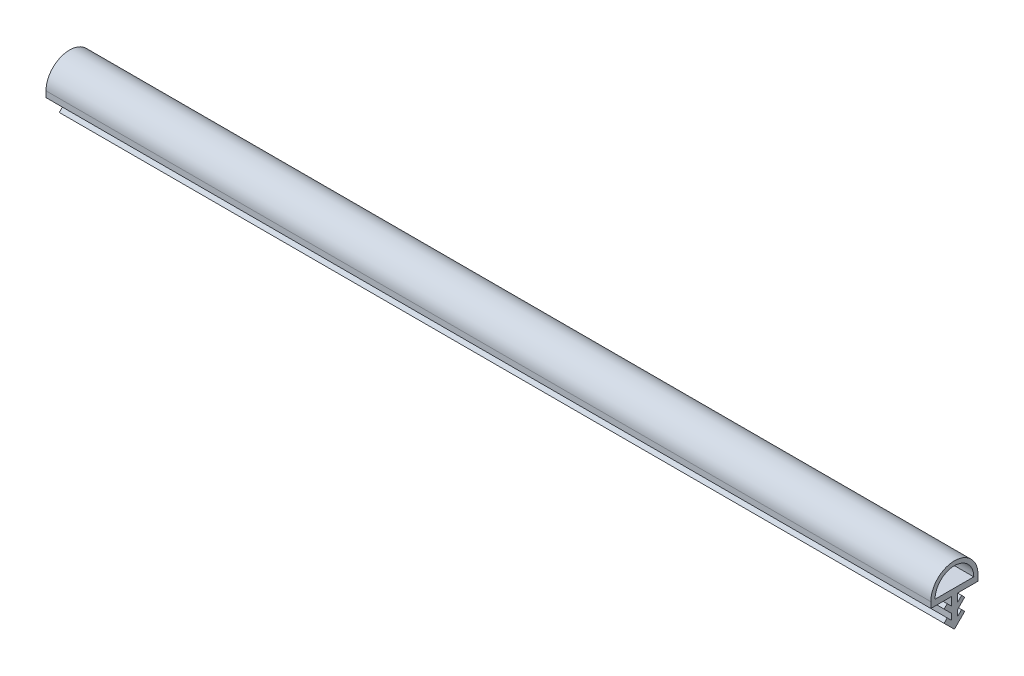
ISO-10303-21;
HEADER;
FILE_DESCRIPTION(('STEP AP214'),'2;1');
FILE_NAME('part.step','',(''),(''),'','','');
FILE_SCHEMA(('AUTOMOTIVE_DESIGN { 1 0 10303 214 1 1 1 1 }'));
ENDSEC;
DATA;
#1=APPLICATION_CONTEXT('core data for automotive mechanical design processes');
#2=APPLICATION_PROTOCOL_DEFINITION('international standard','automotive_design',2000,#1);
#3=PRODUCT_CONTEXT('',#1,'mechanical');
#4=PRODUCT('Part','Part','',(#3));
#5=PRODUCT_RELATED_PRODUCT_CATEGORY('part','',(#4));
#6=PRODUCT_DEFINITION_FORMATION('','',#4);
#7=PRODUCT_DEFINITION_CONTEXT('part definition',#1,'design');
#8=PRODUCT_DEFINITION('design','',#6,#7);
#9=PRODUCT_DEFINITION_SHAPE('','',#8);
#10=(LENGTH_UNIT() NAMED_UNIT(*) SI_UNIT(.MILLI.,.METRE.));
#11=(NAMED_UNIT(*) PLANE_ANGLE_UNIT() SI_UNIT($,.RADIAN.));
#12=(NAMED_UNIT(*) SI_UNIT($,.STERADIAN.) SOLID_ANGLE_UNIT());
#13=UNCERTAINTY_MEASURE_WITH_UNIT(LENGTH_MEASURE(1.E-05),#10,'distance_accuracy_value','');
#14=(GEOMETRIC_REPRESENTATION_CONTEXT(3) GLOBAL_UNCERTAINTY_ASSIGNED_CONTEXT((#13)) GLOBAL_UNIT_ASSIGNED_CONTEXT((#10,
#11,#12)) REPRESENTATION_CONTEXT('',''));
#15=CARTESIAN_POINT('',(0.,0.,0.));
#16=DIRECTION('',(0.,0.,1.));
#17=DIRECTION('',(1.,0.,0.));
#18=AXIS2_PLACEMENT_3D('',#15,#16,#17);
#19=CARTESIAN_POINT('',(-75.,0.999999999999999,0.));
#20=DIRECTION('',(1.,0.,0.));
#21=DIRECTION('',(0.,0.,-1.));
#22=AXIS2_PLACEMENT_3D('',#19,#20,#21);
#23=CYLINDRICAL_SURFACE('',#22,4.);
#24=DIRECTION('',(1.,0.,0.));
#25=VECTOR('',#24,1.);
#26=CARTESIAN_POINT('',(-75.,0.999999999999998,3.99999999999999));
#27=LINE('',#26,#25);
#28=CARTESIAN_POINT('',(-75.,0.999999999999998,3.99999999999999));
#29=VERTEX_POINT('',#28);
#30=CARTESIAN_POINT('',(75.,0.999999999999998,3.99999999999999));
#31=VERTEX_POINT('',#30);
#32=EDGE_CURVE('E40',#29,#31,#27,.T.);
#33=ORIENTED_EDGE('',*,*,#32,.T.);
#34=CARTESIAN_POINT('',(75.,0.999999999999999,0.));
#35=DIRECTION('',(1.,0.,0.));
#36=DIRECTION('',(0.,0.,-1.));
#37=AXIS2_PLACEMENT_3D('',#34,#35,#36);
#38=CIRCLE('',#37,4.);
#39=CARTESIAN_POINT('',(75.,1.,-4.00000000000001));
#40=VERTEX_POINT('',#39);
#41=EDGE_CURVE('E205',#40,#31,#38,.T.);
#42=ORIENTED_EDGE('',*,*,#41,.F.);
#43=DIRECTION('',(1.,0.,0.));
#44=VECTOR('',#43,1.);
#45=CARTESIAN_POINT('',(-75.,1.,-4.00000000000001));
#46=LINE('',#45,#44);
#47=CARTESIAN_POINT('',(-75.,1.,-4.00000000000001));
#48=VERTEX_POINT('',#47);
#49=EDGE_CURVE('E11',#48,#40,#46,.T.);
#50=ORIENTED_EDGE('',*,*,#49,.F.);
#51=CARTESIAN_POINT('',(-75.,0.999999999999999,0.));
#52=DIRECTION('',(1.,0.,0.));
#53=DIRECTION('',(0.,0.,-1.));
#54=AXIS2_PLACEMENT_3D('',#51,#52,#53);
#55=CIRCLE('',#54,4.);
#56=EDGE_CURVE('E199',#48,#29,#55,.T.);
#57=ORIENTED_EDGE('',*,*,#56,.T.);
#58=EDGE_LOOP('',(#33,#42,#50,#57));
#59=FACE_BOUND('',#58,.T.);
#60=ADVANCED_FACE('F37',(#59),#23,.T.);
#61=CARTESIAN_POINT('',(-75.,0.,-4.));
#62=DIRECTION('',(0.,0.,-1.));
#63=DIRECTION('',(0.,1.,0.));
#64=AXIS2_PLACEMENT_3D('',#61,#62,#63);
#65=PLANE('',#64);
#66=ORIENTED_EDGE('',*,*,#49,.T.);
#67=DIRECTION('',(0.,1.,0.));
#68=VECTOR('',#67,1.);
#69=CARTESIAN_POINT('',(75.,0.,-4.));
#70=LINE('',#69,#68);
#71=CARTESIAN_POINT('',(75.,0.,-4.));
#72=VERTEX_POINT('',#71);
#73=EDGE_CURVE('E269',#72,#40,#70,.T.);
#74=ORIENTED_EDGE('',*,*,#73,.F.);
#75=DIRECTION('',(1.,0.,0.));
#76=VECTOR('',#75,1.);
#77=CARTESIAN_POINT('',(-75.,0.,-4.));
#78=LINE('',#77,#76);
#79=CARTESIAN_POINT('',(-75.,0.,-4.));
#80=VERTEX_POINT('',#79);
#81=EDGE_CURVE('E45',#80,#72,#78,.T.);
#82=ORIENTED_EDGE('',*,*,#81,.F.);
#83=DIRECTION('',(0.,1.,0.));
#84=VECTOR('',#83,1.);
#85=CARTESIAN_POINT('',(-75.,0.,-4.));
#86=LINE('',#85,#84);
#87=EDGE_CURVE('E334',#80,#48,#86,.T.);
#88=ORIENTED_EDGE('',*,*,#87,.T.);
#89=EDGE_LOOP('',(#66,#74,#82,#88));
#90=FACE_BOUND('',#89,.T.);
#91=ADVANCED_FACE('F381',(#90),#65,.T.);
#92=CARTESIAN_POINT('',(-75.,0.,-4.));
#93=DIRECTION('',(0.,-1.,0.));
#94=DIRECTION('',(0.,0.,-1.));
#95=AXIS2_PLACEMENT_3D('',#92,#93,#94);
#96=PLANE('',#95);
#97=ORIENTED_EDGE('',*,*,#81,.T.);
#98=DIRECTION('',(0.,0.,-1.));
#99=VECTOR('',#98,1.);
#100=CARTESIAN_POINT('',(75.,0.,-4.));
#101=LINE('',#100,#99);
#102=CARTESIAN_POINT('',(75.,0.,-0.500000000000004));
#103=VERTEX_POINT('',#102);
#104=EDGE_CURVE('E266',#103,#72,#101,.T.);
#105=ORIENTED_EDGE('',*,*,#104,.F.);
#106=DIRECTION('',(1.,0.,0.));
#107=VECTOR('',#106,1.);
#108=CARTESIAN_POINT('',(-75.,0.,-0.500000000000004));
#109=LINE('',#108,#107);
#110=CARTESIAN_POINT('',(-75.,0.,-0.500000000000004));
#111=VERTEX_POINT('',#110);
#112=EDGE_CURVE('E338',#111,#103,#109,.T.);
#113=ORIENTED_EDGE('',*,*,#112,.F.);
#114=DIRECTION('',(0.,0.,-1.));
#115=VECTOR('',#114,1.);
#116=CARTESIAN_POINT('',(-75.,0.,-4.));
#117=LINE('',#116,#115);
#118=EDGE_CURVE('E331',#111,#80,#117,.T.);
#119=ORIENTED_EDGE('',*,*,#118,.T.);
#120=EDGE_LOOP('',(#97,#105,#113,#119));
#121=FACE_BOUND('',#120,.T.);
#122=ADVANCED_FACE('F454',(#121),#96,.T.);
#123=CARTESIAN_POINT('',(-75.,0.,-0.500000000000004));
#124=DIRECTION('',(0.,0.,-1.));
#125=DIRECTION('',(0.,1.,0.));
#126=AXIS2_PLACEMENT_3D('',#123,#124,#125);
#127=PLANE('',#126);
#128=ORIENTED_EDGE('',*,*,#112,.T.);
#129=DIRECTION('',(0.,1.,0.));
#130=VECTOR('',#129,1.);
#131=CARTESIAN_POINT('',(75.,0.,-0.500000000000004));
#132=LINE('',#131,#130);
#133=CARTESIAN_POINT('',(75.,-1.40674866857341,-0.499999999999996));
#134=VERTEX_POINT('',#133);
#135=EDGE_CURVE('E263',#134,#103,#132,.T.);
#136=ORIENTED_EDGE('',*,*,#135,.F.);
#137=DIRECTION('',(1.,0.,0.));
#138=VECTOR('',#137,1.);
#139=CARTESIAN_POINT('',(-75.,-1.40674866857341,-0.499999999999996));
#140=LINE('',#139,#138);
#141=CARTESIAN_POINT('',(-75.,-1.40674866857341,-0.499999999999996));
#142=VERTEX_POINT('',#141);
#143=EDGE_CURVE('E340',#142,#134,#140,.T.);
#144=ORIENTED_EDGE('',*,*,#143,.F.);
#145=DIRECTION('',(0.,1.,0.));
#146=VECTOR('',#145,1.);
#147=CARTESIAN_POINT('',(-75.,0.,-0.500000000000004));
#148=LINE('',#147,#146);
#149=EDGE_CURVE('E328',#142,#111,#148,.T.);
#150=ORIENTED_EDGE('',*,*,#149,.T.);
#151=EDGE_LOOP('',(#128,#136,#144,#150));
#152=FACE_BOUND('',#151,.T.);
#153=ADVANCED_FACE('F452',(#152),#127,.T.);
#154=CARTESIAN_POINT('',(-75.,-1.40674866857341,-0.499999999999996));
#155=DIRECTION('',(0.,0.707106781186547,0.707106781186548));
#156=DIRECTION('',(0.,-0.707106781186548,0.707106781186547));
#157=AXIS2_PLACEMENT_3D('',#154,#155,#156);
#158=PLANE('',#157);
#159=ORIENTED_EDGE('',*,*,#143,.T.);
#160=DIRECTION('',(0.,-0.707106781186548,0.707106781186547));
#161=VECTOR('',#160,1.);
#162=CARTESIAN_POINT('',(75.,-1.40674866857341,-0.499999999999996));
#163=LINE('',#162,#161);
#164=CARTESIAN_POINT('',(75.,-0.687078754463317,-1.21966991411008));
#165=VERTEX_POINT('',#164);
#166=EDGE_CURVE('E260',#165,#134,#163,.T.);
#167=ORIENTED_EDGE('',*,*,#166,.F.);
#168=DIRECTION('',(1.,0.,0.));
#169=VECTOR('',#168,1.);
#170=CARTESIAN_POINT('',(-75.,-0.687078754463317,-1.21966991411008));
#171=LINE('',#170,#169);
#172=CARTESIAN_POINT('',(-75.,-0.687078754463317,-1.21966991411008));
#173=VERTEX_POINT('',#172);
#174=EDGE_CURVE('E342',#173,#165,#171,.T.);
#175=ORIENTED_EDGE('',*,*,#174,.F.);
#176=DIRECTION('',(0.,-0.707106781186548,0.707106781186547));
#177=VECTOR('',#176,1.);
#178=CARTESIAN_POINT('',(-75.,-1.40674866857341,-0.499999999999996));
#179=LINE('',#178,#177);
#180=EDGE_CURVE('E325',#173,#142,#179,.T.);
#181=ORIENTED_EDGE('',*,*,#180,.T.);
#182=EDGE_LOOP('',(#159,#167,#175,#181));
#183=FACE_BOUND('',#182,.T.);
#184=ADVANCED_FACE('F448',(#183),#158,.T.);
#185=CARTESIAN_POINT('',(-75.,-0.687078754463317,-1.21966991411008));
#186=DIRECTION('',(0.,0.707106781186547,-0.707106781186548));
#187=DIRECTION('',(0.,0.707106781186548,0.707106781186547));
#188=AXIS2_PLACEMENT_3D('',#185,#186,#187);
#189=PLANE('',#188);
#190=ORIENTED_EDGE('',*,*,#174,.T.);
#191=DIRECTION('',(0.,0.707106781186548,0.707106781186547));
#192=VECTOR('',#191,1.);
#193=CARTESIAN_POINT('',(75.,-0.687078754463317,-1.21966991411008));
#194=LINE('',#193,#192);
#195=CARTESIAN_POINT('',(75.,-1.21740884035323,-1.75));
#196=VERTEX_POINT('',#195);
#197=EDGE_CURVE('E257',#196,#165,#194,.T.);
#198=ORIENTED_EDGE('',*,*,#197,.F.);
#199=DIRECTION('',(1.,0.,0.));
#200=VECTOR('',#199,1.);
#201=CARTESIAN_POINT('',(-75.,-1.21740884035323,-1.75));
#202=LINE('',#201,#200);
#203=CARTESIAN_POINT('',(-75.,-1.21740884035323,-1.75));
#204=VERTEX_POINT('',#203);
#205=EDGE_CURVE('E344',#204,#196,#202,.T.);
#206=ORIENTED_EDGE('',*,*,#205,.F.);
#207=DIRECTION('',(0.,0.707106781186548,0.707106781186547));
#208=VECTOR('',#207,1.);
#209=CARTESIAN_POINT('',(-75.,-0.687078754463317,-1.21966991411008));
#210=LINE('',#209,#208);
#211=EDGE_CURVE('E322',#204,#173,#210,.T.);
#212=ORIENTED_EDGE('',*,*,#211,.T.);
#213=EDGE_LOOP('',(#190,#198,#206,#212));
#214=FACE_BOUND('',#213,.T.);
#215=ADVANCED_FACE('F445',(#214),#189,.T.);
#216=CARTESIAN_POINT('',(-75.,-1.21740884035323,-1.75));
#217=DIRECTION('',(0.,-0.707106781186548,-0.707106781186547));
#218=DIRECTION('',(0.,0.707106781186547,-0.707106781186548));
#219=AXIS2_PLACEMENT_3D('',#216,#217,#218);
#220=PLANE('',#219);
#221=ORIENTED_EDGE('',*,*,#205,.T.);
#222=DIRECTION('',(0.,0.707106781186547,-0.707106781186548));
#223=VECTOR('',#222,1.);
#224=CARTESIAN_POINT('',(75.,-1.21740884035323,-1.75));
#225=LINE('',#224,#223);
#226=CARTESIAN_POINT('',(75.,-2.46740884035323,-0.499999999999995));
#227=VERTEX_POINT('',#226);
#228=EDGE_CURVE('E254',#227,#196,#225,.T.);
#229=ORIENTED_EDGE('',*,*,#228,.F.);
#230=DIRECTION('',(1.,0.,0.));
#231=VECTOR('',#230,1.);
#232=CARTESIAN_POINT('',(-75.,-2.46740884035323,-0.499999999999995));
#233=LINE('',#232,#231);
#234=CARTESIAN_POINT('',(-75.,-2.46740884035323,-0.499999999999995));
#235=VERTEX_POINT('',#234);
#236=EDGE_CURVE('E346',#235,#227,#233,.T.);
#237=ORIENTED_EDGE('',*,*,#236,.F.);
#238=DIRECTION('',(0.,0.707106781186547,-0.707106781186548));
#239=VECTOR('',#238,1.);
#240=CARTESIAN_POINT('',(-75.,-1.21740884035323,-1.75));
#241=LINE('',#240,#239);
#242=EDGE_CURVE('E319',#235,#204,#241,.T.);
#243=ORIENTED_EDGE('',*,*,#242,.T.);
#244=EDGE_LOOP('',(#221,#229,#237,#243));
#245=FACE_BOUND('',#244,.T.);
#246=ADVANCED_FACE('F443',(#245),#220,.T.);
#247=CARTESIAN_POINT('',(-75.,-2.46740884035323,-0.499999999999995));
#248=DIRECTION('',(0.,0.,-1.));
#249=DIRECTION('',(-1.,0.,0.));
#250=AXIS2_PLACEMENT_3D('',#247,#248,#249);
#251=PLANE('',#250);
#252=ORIENTED_EDGE('',*,*,#236,.T.);
#253=DIRECTION('',(0.,1.,0.));
#254=VECTOR('',#253,1.);
#255=CARTESIAN_POINT('',(75.,-2.46740884035323,-0.499999999999995));
#256=LINE('',#255,#254);
#257=CARTESIAN_POINT('',(75.,-3.49335212001675,-0.499999999999995));
#258=VERTEX_POINT('',#257);
#259=EDGE_CURVE('E251',#258,#227,#256,.T.);
#260=ORIENTED_EDGE('',*,*,#259,.F.);
#261=DIRECTION('',(1.,0.,0.));
#262=VECTOR('',#261,1.);
#263=CARTESIAN_POINT('',(-75.,-3.49335212001675,-0.499999999999995));
#264=LINE('',#263,#262);
#265=CARTESIAN_POINT('',(-75.,-3.49335212001675,-0.499999999999995));
#266=VERTEX_POINT('',#265);
#267=EDGE_CURVE('E348',#266,#258,#264,.T.);
#268=ORIENTED_EDGE('',*,*,#267,.F.);
#269=DIRECTION('',(0.,1.,0.));
#270=VECTOR('',#269,1.);
#271=CARTESIAN_POINT('',(-75.,-2.46740884035323,-0.499999999999995));
#272=LINE('',#271,#270);
#273=EDGE_CURVE('E316',#266,#235,#272,.T.);
#274=ORIENTED_EDGE('',*,*,#273,.T.);
#275=EDGE_LOOP('',(#252,#260,#268,#274));
#276=FACE_BOUND('',#275,.T.);
#277=ADVANCED_FACE('F438',(#276),#251,.T.);
#278=CARTESIAN_POINT('',(-75.,-3.49335212001675,-0.499999999999995));
#279=DIRECTION('',(0.,0.707106781186547,0.707106781186548));
#280=DIRECTION('',(0.,-0.707106781186548,0.707106781186547));
#281=AXIS2_PLACEMENT_3D('',#278,#279,#280);
#282=PLANE('',#281);
#283=ORIENTED_EDGE('',*,*,#267,.T.);
#284=DIRECTION('',(0.,-0.707106781186548,0.707106781186547));
#285=VECTOR('',#284,1.);
#286=CARTESIAN_POINT('',(75.,-3.49335212001675,-0.499999999999995));
#287=LINE('',#286,#285);
#288=CARTESIAN_POINT('',(75.,-2.77368220590665,-1.21966991411009));
#289=VERTEX_POINT('',#288);
#290=EDGE_CURVE('E248',#289,#258,#287,.T.);
#291=ORIENTED_EDGE('',*,*,#290,.F.);
#292=DIRECTION('',(1.,0.,0.));
#293=VECTOR('',#292,1.);
#294=CARTESIAN_POINT('',(-75.,-2.77368220590665,-1.21966991411009));
#295=LINE('',#294,#293);
#296=CARTESIAN_POINT('',(-75.,-2.77368220590665,-1.21966991411009));
#297=VERTEX_POINT('',#296);
#298=EDGE_CURVE('E350',#297,#289,#295,.T.);
#299=ORIENTED_EDGE('',*,*,#298,.F.);
#300=DIRECTION('',(0.,-0.707106781186548,0.707106781186547));
#301=VECTOR('',#300,1.);
#302=CARTESIAN_POINT('',(-75.,-3.49335212001675,-0.499999999999995));
#303=LINE('',#302,#301);
#304=EDGE_CURVE('E313',#297,#266,#303,.T.);
#305=ORIENTED_EDGE('',*,*,#304,.T.);
#306=EDGE_LOOP('',(#283,#291,#299,#305));
#307=FACE_BOUND('',#306,.T.);
#308=ADVANCED_FACE('F433',(#307),#282,.T.);
#309=CARTESIAN_POINT('',(-75.,-2.77368220590665,-1.21966991411009));
#310=DIRECTION('',(0.,0.707106781186547,-0.707106781186548));
#311=DIRECTION('',(0.,0.707106781186548,0.707106781186547));
#312=AXIS2_PLACEMENT_3D('',#309,#310,#311);
#313=PLANE('',#312);
#314=ORIENTED_EDGE('',*,*,#298,.T.);
#315=DIRECTION('',(0.,0.707106781186548,0.707106781186547));
#316=VECTOR('',#315,1.);
#317=CARTESIAN_POINT('',(75.,-2.77368220590665,-1.21966991411009));
#318=LINE('',#317,#316);
#319=CARTESIAN_POINT('',(75.,-3.30401229179656,-1.75));
#320=VERTEX_POINT('',#319);
#321=EDGE_CURVE('E245',#320,#289,#318,.T.);
#322=ORIENTED_EDGE('',*,*,#321,.F.);
#323=DIRECTION('',(1.,0.,0.));
#324=VECTOR('',#323,1.);
#325=CARTESIAN_POINT('',(-75.,-3.30401229179656,-1.75));
#326=LINE('',#325,#324);
#327=CARTESIAN_POINT('',(-75.,-3.30401229179656,-1.75));
#328=VERTEX_POINT('',#327);
#329=EDGE_CURVE('E352',#328,#320,#326,.T.);
#330=ORIENTED_EDGE('',*,*,#329,.F.);
#331=DIRECTION('',(0.,0.707106781186548,0.707106781186547));
#332=VECTOR('',#331,1.);
#333=CARTESIAN_POINT('',(-75.,-2.77368220590665,-1.21966991411009));
#334=LINE('',#333,#332);
#335=EDGE_CURVE('E310',#328,#297,#334,.T.);
#336=ORIENTED_EDGE('',*,*,#335,.T.);
#337=EDGE_LOOP('',(#314,#322,#330,#336));
#338=FACE_BOUND('',#337,.T.);
#339=ADVANCED_FACE('F431',(#338),#313,.T.);
#340=CARTESIAN_POINT('',(-75.,-3.30401229179656,-1.75));
#341=DIRECTION('',(0.,-0.707106781186547,-0.707106781186548));
#342=DIRECTION('',(0.,0.707106781186548,-0.707106781186547));
#343=AXIS2_PLACEMENT_3D('',#340,#341,#342);
#344=PLANE('',#343);
#345=ORIENTED_EDGE('',*,*,#329,.T.);
#346=DIRECTION('',(0.,0.707106781186548,-0.707106781186547));
#347=VECTOR('',#346,1.);
#348=CARTESIAN_POINT('',(75.,-3.30401229179656,-1.75));
#349=LINE('',#348,#347);
#350=CARTESIAN_POINT('',(75.,-5.05401229179656,0.));
#351=VERTEX_POINT('',#350);
#352=EDGE_CURVE('E242',#351,#320,#349,.T.);
#353=ORIENTED_EDGE('',*,*,#352,.F.);
#354=DIRECTION('',(1.,0.,0.));
#355=VECTOR('',#354,1.);
#356=CARTESIAN_POINT('',(-75.,-5.05401229179656,0.));
#357=LINE('',#356,#355);
#358=CARTESIAN_POINT('',(-75.,-5.05401229179656,0.));
#359=VERTEX_POINT('',#358);
#360=EDGE_CURVE('E354',#359,#351,#357,.T.);
#361=ORIENTED_EDGE('',*,*,#360,.F.);
#362=DIRECTION('',(0.,0.707106781186548,-0.707106781186547));
#363=VECTOR('',#362,1.);
#364=CARTESIAN_POINT('',(-75.,-3.30401229179656,-1.75));
#365=LINE('',#364,#363);
#366=EDGE_CURVE('E307',#359,#328,#365,.T.);
#367=ORIENTED_EDGE('',*,*,#366,.T.);
#368=EDGE_LOOP('',(#345,#353,#361,#367));
#369=FACE_BOUND('',#368,.T.);
#370=ADVANCED_FACE('F426',(#369),#344,.T.);
#371=CARTESIAN_POINT('',(-75.,-3.30401229179656,1.75));
#372=DIRECTION('',(0.,-0.707106781186547,0.707106781186548));
#373=DIRECTION('',(0.,-0.707106781186548,-0.707106781186547));
#374=AXIS2_PLACEMENT_3D('',#371,#372,#373);
#375=PLANE('',#374);
#376=ORIENTED_EDGE('',*,*,#360,.T.);
#377=DIRECTION('',(0.,-0.707106781186548,-0.707106781186547));
#378=VECTOR('',#377,1.);
#379=CARTESIAN_POINT('',(75.,-3.30401229179656,1.75));
#380=LINE('',#379,#378);
#381=CARTESIAN_POINT('',(75.,-3.30401229179656,1.75));
#382=VERTEX_POINT('',#381);
#383=EDGE_CURVE('E239',#382,#351,#380,.T.);
#384=ORIENTED_EDGE('',*,*,#383,.F.);
#385=DIRECTION('',(1.,0.,0.));
#386=VECTOR('',#385,1.);
#387=CARTESIAN_POINT('',(-75.,-3.30401229179656,1.75));
#388=LINE('',#387,#386);
#389=CARTESIAN_POINT('',(-75.,-3.30401229179656,1.75));
#390=VERTEX_POINT('',#389);
#391=EDGE_CURVE('E356',#390,#382,#388,.T.);
#392=ORIENTED_EDGE('',*,*,#391,.F.);
#393=DIRECTION('',(0.,-0.707106781186548,-0.707106781186547));
#394=VECTOR('',#393,1.);
#395=CARTESIAN_POINT('',(-75.,-3.30401229179656,1.75));
#396=LINE('',#395,#394);
#397=EDGE_CURVE('E304',#390,#359,#396,.T.);
#398=ORIENTED_EDGE('',*,*,#397,.T.);
#399=EDGE_LOOP('',(#376,#384,#392,#398));
#400=FACE_BOUND('',#399,.T.);
#401=ADVANCED_FACE('F421',(#400),#375,.T.);
#402=CARTESIAN_POINT('',(-75.,-2.77368220590665,1.21966991411009));
#403=DIRECTION('',(0.,0.707106781186547,0.707106781186548));
#404=DIRECTION('',(0.,-0.707106781186548,0.707106781186547));
#405=AXIS2_PLACEMENT_3D('',#402,#403,#404);
#406=PLANE('',#405);
#407=ORIENTED_EDGE('',*,*,#391,.T.);
#408=DIRECTION('',(0.,-0.707106781186548,0.707106781186547));
#409=VECTOR('',#408,1.);
#410=CARTESIAN_POINT('',(75.,-2.77368220590665,1.21966991411009));
#411=LINE('',#410,#409);
#412=CARTESIAN_POINT('',(75.,-2.77368220590665,1.21966991411009));
#413=VERTEX_POINT('',#412);
#414=EDGE_CURVE('E236',#413,#382,#411,.T.);
#415=ORIENTED_EDGE('',*,*,#414,.F.);
#416=DIRECTION('',(1.,0.,0.));
#417=VECTOR('',#416,1.);
#418=CARTESIAN_POINT('',(-75.,-2.77368220590665,1.21966991411009));
#419=LINE('',#418,#417);
#420=CARTESIAN_POINT('',(-75.,-2.77368220590665,1.21966991411009));
#421=VERTEX_POINT('',#420);
#422=EDGE_CURVE('E358',#421,#413,#419,.T.);
#423=ORIENTED_EDGE('',*,*,#422,.F.);
#424=DIRECTION('',(0.,-0.707106781186548,0.707106781186547));
#425=VECTOR('',#424,1.);
#426=CARTESIAN_POINT('',(-75.,-2.77368220590665,1.21966991411009));
#427=LINE('',#426,#425);
#428=EDGE_CURVE('E301',#421,#390,#427,.T.);
#429=ORIENTED_EDGE('',*,*,#428,.T.);
#430=EDGE_LOOP('',(#407,#415,#423,#429));
#431=FACE_BOUND('',#430,.T.);
#432=ADVANCED_FACE('F419',(#431),#406,.T.);
#433=CARTESIAN_POINT('',(-75.,-3.49335212001675,0.499999999999995));
#434=DIRECTION('',(0.,0.707106781186547,-0.707106781186548));
#435=DIRECTION('',(0.,0.707106781186548,0.707106781186547));
#436=AXIS2_PLACEMENT_3D('',#433,#434,#435);
#437=PLANE('',#436);
#438=ORIENTED_EDGE('',*,*,#422,.T.);
#439=DIRECTION('',(0.,0.707106781186548,0.707106781186547));
#440=VECTOR('',#439,1.);
#441=CARTESIAN_POINT('',(75.,-3.49335212001675,0.499999999999995));
#442=LINE('',#441,#440);
#443=CARTESIAN_POINT('',(75.,-3.49335212001675,0.499999999999995));
#444=VERTEX_POINT('',#443);
#445=EDGE_CURVE('E233',#444,#413,#442,.T.);
#446=ORIENTED_EDGE('',*,*,#445,.F.);
#447=DIRECTION('',(1.,0.,0.));
#448=VECTOR('',#447,1.);
#449=CARTESIAN_POINT('',(-75.,-3.49335212001675,0.499999999999995));
#450=LINE('',#449,#448);
#451=CARTESIAN_POINT('',(-75.,-3.49335212001675,0.499999999999995));
#452=VERTEX_POINT('',#451);
#453=EDGE_CURVE('E360',#452,#444,#450,.T.);
#454=ORIENTED_EDGE('',*,*,#453,.F.);
#455=DIRECTION('',(0.,0.707106781186548,0.707106781186547));
#456=VECTOR('',#455,1.);
#457=CARTESIAN_POINT('',(-75.,-3.49335212001675,0.499999999999995));
#458=LINE('',#457,#456);
#459=EDGE_CURVE('E298',#452,#421,#458,.T.);
#460=ORIENTED_EDGE('',*,*,#459,.T.);
#461=EDGE_LOOP('',(#438,#446,#454,#460));
#462=FACE_BOUND('',#461,.T.);
#463=ADVANCED_FACE('F414',(#462),#437,.T.);
#464=CARTESIAN_POINT('',(-75.,-2.46740884035323,0.499999999999995));
#465=DIRECTION('',(0.,0.,1.));
#466=DIRECTION('',(1.,0.,0.));
#467=AXIS2_PLACEMENT_3D('',#464,#465,#466);
#468=PLANE('',#467);
#469=ORIENTED_EDGE('',*,*,#453,.T.);
#470=DIRECTION('',(0.,-1.,0.));
#471=VECTOR('',#470,1.);
#472=CARTESIAN_POINT('',(75.,-2.46740884035323,0.499999999999995));
#473=LINE('',#472,#471);
#474=CARTESIAN_POINT('',(75.,-2.46740884035323,0.499999999999995));
#475=VERTEX_POINT('',#474);
#476=EDGE_CURVE('E230',#475,#444,#473,.T.);
#477=ORIENTED_EDGE('',*,*,#476,.F.);
#478=DIRECTION('',(1.,0.,0.));
#479=VECTOR('',#478,1.);
#480=CARTESIAN_POINT('',(-75.,-2.46740884035323,0.499999999999995));
#481=LINE('',#480,#479);
#482=CARTESIAN_POINT('',(-75.,-2.46740884035323,0.499999999999995));
#483=VERTEX_POINT('',#482);
#484=EDGE_CURVE('E362',#483,#475,#481,.T.);
#485=ORIENTED_EDGE('',*,*,#484,.F.);
#486=DIRECTION('',(0.,-1.,0.));
#487=VECTOR('',#486,1.);
#488=CARTESIAN_POINT('',(-75.,-2.46740884035323,0.499999999999995));
#489=LINE('',#488,#487);
#490=EDGE_CURVE('E295',#483,#452,#489,.T.);
#491=ORIENTED_EDGE('',*,*,#490,.T.);
#492=EDGE_LOOP('',(#469,#477,#485,#491));
#493=FACE_BOUND('',#492,.T.);
#494=ADVANCED_FACE('F409',(#493),#468,.T.);
#495=CARTESIAN_POINT('',(-75.,-1.21740884035323,1.75));
#496=DIRECTION('',(0.,-0.707106781186548,0.707106781186547));
#497=DIRECTION('',(0.,-0.707106781186547,-0.707106781186548));
#498=AXIS2_PLACEMENT_3D('',#495,#496,#497);
#499=PLANE('',#498);
#500=ORIENTED_EDGE('',*,*,#484,.T.);
#501=DIRECTION('',(0.,-0.707106781186547,-0.707106781186548));
#502=VECTOR('',#501,1.);
#503=CARTESIAN_POINT('',(75.,-1.21740884035323,1.75));
#504=LINE('',#503,#502);
#505=CARTESIAN_POINT('',(75.,-1.21740884035323,1.75));
#506=VERTEX_POINT('',#505);
#507=EDGE_CURVE('E227',#506,#475,#504,.T.);
#508=ORIENTED_EDGE('',*,*,#507,.F.);
#509=DIRECTION('',(1.,0.,0.));
#510=VECTOR('',#509,1.);
#511=CARTESIAN_POINT('',(-75.,-1.21740884035323,1.75));
#512=LINE('',#511,#510);
#513=CARTESIAN_POINT('',(-75.,-1.21740884035323,1.75));
#514=VERTEX_POINT('',#513);
#515=EDGE_CURVE('E364',#514,#506,#512,.T.);
#516=ORIENTED_EDGE('',*,*,#515,.F.);
#517=DIRECTION('',(0.,-0.707106781186547,-0.707106781186548));
#518=VECTOR('',#517,1.);
#519=CARTESIAN_POINT('',(-75.,-1.21740884035323,1.75));
#520=LINE('',#519,#518);
#521=EDGE_CURVE('E292',#514,#483,#520,.T.);
#522=ORIENTED_EDGE('',*,*,#521,.T.);
#523=EDGE_LOOP('',(#500,#508,#516,#522));
#524=FACE_BOUND('',#523,.T.);
#525=ADVANCED_FACE('F407',(#524),#499,.T.);
#526=CARTESIAN_POINT('',(-75.,-0.687078754463317,1.21966991411008));
#527=DIRECTION('',(0.,0.707106781186547,0.707106781186548));
#528=DIRECTION('',(0.,-0.707106781186548,0.707106781186547));
#529=AXIS2_PLACEMENT_3D('',#526,#527,#528);
#530=PLANE('',#529);
#531=ORIENTED_EDGE('',*,*,#515,.T.);
#532=DIRECTION('',(0.,-0.707106781186548,0.707106781186547));
#533=VECTOR('',#532,1.);
#534=CARTESIAN_POINT('',(75.,-0.687078754463317,1.21966991411008));
#535=LINE('',#534,#533);
#536=CARTESIAN_POINT('',(75.,-0.687078754463317,1.21966991411008));
#537=VERTEX_POINT('',#536);
#538=EDGE_CURVE('E224',#537,#506,#535,.T.);
#539=ORIENTED_EDGE('',*,*,#538,.F.);
#540=DIRECTION('',(1.,0.,0.));
#541=VECTOR('',#540,1.);
#542=CARTESIAN_POINT('',(-75.,-0.687078754463317,1.21966991411008));
#543=LINE('',#542,#541);
#544=CARTESIAN_POINT('',(-75.,-0.687078754463317,1.21966991411008));
#545=VERTEX_POINT('',#544);
#546=EDGE_CURVE('E366',#545,#537,#543,.T.);
#547=ORIENTED_EDGE('',*,*,#546,.F.);
#548=DIRECTION('',(0.,-0.707106781186548,0.707106781186547));
#549=VECTOR('',#548,1.);
#550=CARTESIAN_POINT('',(-75.,-0.687078754463317,1.21966991411008));
#551=LINE('',#550,#549);
#552=EDGE_CURVE('E289',#545,#514,#551,.T.);
#553=ORIENTED_EDGE('',*,*,#552,.T.);
#554=EDGE_LOOP('',(#531,#539,#547,#553));
#555=FACE_BOUND('',#554,.T.);
#556=ADVANCED_FACE('F402',(#555),#530,.T.);
#557=CARTESIAN_POINT('',(-75.,-1.40674866857341,0.499999999999996));
#558=DIRECTION('',(0.,0.707106781186547,-0.707106781186548));
#559=DIRECTION('',(0.,0.707106781186548,0.707106781186547));
#560=AXIS2_PLACEMENT_3D('',#557,#558,#559);
#561=PLANE('',#560);
#562=ORIENTED_EDGE('',*,*,#546,.T.);
#563=DIRECTION('',(0.,0.707106781186548,0.707106781186547));
#564=VECTOR('',#563,1.);
#565=CARTESIAN_POINT('',(75.,-1.40674866857341,0.499999999999996));
#566=LINE('',#565,#564);
#567=CARTESIAN_POINT('',(75.,-1.40674866857341,0.499999999999996));
#568=VERTEX_POINT('',#567);
#569=EDGE_CURVE('E221',#568,#537,#566,.T.);
#570=ORIENTED_EDGE('',*,*,#569,.F.);
#571=DIRECTION('',(1.,0.,0.));
#572=VECTOR('',#571,1.);
#573=CARTESIAN_POINT('',(-75.,-1.40674866857341,0.499999999999996));
#574=LINE('',#573,#572);
#575=CARTESIAN_POINT('',(-75.,-1.40674866857341,0.499999999999996));
#576=VERTEX_POINT('',#575);
#577=EDGE_CURVE('E368',#576,#568,#574,.T.);
#578=ORIENTED_EDGE('',*,*,#577,.F.);
#579=DIRECTION('',(0.,0.707106781186548,0.707106781186547));
#580=VECTOR('',#579,1.);
#581=CARTESIAN_POINT('',(-75.,-1.40674866857341,0.499999999999996));
#582=LINE('',#581,#580);
#583=EDGE_CURVE('E286',#576,#545,#582,.T.);
#584=ORIENTED_EDGE('',*,*,#583,.T.);
#585=EDGE_LOOP('',(#562,#570,#578,#584));
#586=FACE_BOUND('',#585,.T.);
#587=ADVANCED_FACE('F397',(#586),#561,.T.);
#588=CARTESIAN_POINT('',(-75.,0.,0.499999999999996));
#589=DIRECTION('',(0.,0.,1.));
#590=DIRECTION('',(1.,0.,0.));
#591=AXIS2_PLACEMENT_3D('',#588,#589,#590);
#592=PLANE('',#591);
#593=ORIENTED_EDGE('',*,*,#577,.T.);
#594=DIRECTION('',(0.,-1.,0.));
#595=VECTOR('',#594,1.);
#596=CARTESIAN_POINT('',(75.,0.,0.499999999999996));
#597=LINE('',#596,#595);
#598=CARTESIAN_POINT('',(75.,0.,0.499999999999996));
#599=VERTEX_POINT('',#598);
#600=EDGE_CURVE('E218',#599,#568,#597,.T.);
#601=ORIENTED_EDGE('',*,*,#600,.F.);
#602=DIRECTION('',(1.,0.,0.));
#603=VECTOR('',#602,1.);
#604=CARTESIAN_POINT('',(-75.,0.,0.499999999999996));
#605=LINE('',#604,#603);
#606=CARTESIAN_POINT('',(-75.,0.,0.499999999999996));
#607=VERTEX_POINT('',#606);
#608=EDGE_CURVE('E370',#607,#599,#605,.T.);
#609=ORIENTED_EDGE('',*,*,#608,.F.);
#610=DIRECTION('',(0.,-1.,0.));
#611=VECTOR('',#610,1.);
#612=CARTESIAN_POINT('',(-75.,0.,0.499999999999996));
#613=LINE('',#612,#611);
#614=EDGE_CURVE('E283',#607,#576,#613,.T.);
#615=ORIENTED_EDGE('',*,*,#614,.T.);
#616=EDGE_LOOP('',(#593,#601,#609,#615));
#617=FACE_BOUND('',#616,.T.);
#618=ADVANCED_FACE('F395',(#617),#592,.T.);
#619=CARTESIAN_POINT('',(-75.,0.,4.));
#620=DIRECTION('',(0.,-1.,0.));
#621=DIRECTION('',(0.,0.,-1.));
#622=AXIS2_PLACEMENT_3D('',#619,#620,#621);
#623=PLANE('',#622);
#624=ORIENTED_EDGE('',*,*,#608,.T.);
#625=DIRECTION('',(0.,0.,-1.));
#626=VECTOR('',#625,1.);
#627=CARTESIAN_POINT('',(75.,0.,4.));
#628=LINE('',#627,#626);
#629=CARTESIAN_POINT('',(75.,0.,4.));
#630=VERTEX_POINT('',#629);
#631=EDGE_CURVE('E215',#630,#599,#628,.T.);
#632=ORIENTED_EDGE('',*,*,#631,.F.);
#633=DIRECTION('',(1.,0.,0.));
#634=VECTOR('',#633,1.);
#635=CARTESIAN_POINT('',(-75.,0.,4.));
#636=LINE('',#635,#634);
#637=CARTESIAN_POINT('',(-75.,0.,4.));
#638=VERTEX_POINT('',#637);
#639=EDGE_CURVE('E371',#638,#630,#636,.T.);
#640=ORIENTED_EDGE('',*,*,#639,.F.);
#641=DIRECTION('',(0.,0.,-1.));
#642=VECTOR('',#641,1.);
#643=CARTESIAN_POINT('',(-75.,0.,4.));
#644=LINE('',#643,#642);
#645=EDGE_CURVE('E280',#638,#607,#644,.T.);
#646=ORIENTED_EDGE('',*,*,#645,.T.);
#647=EDGE_LOOP('',(#624,#632,#640,#646));
#648=FACE_BOUND('',#647,.T.);
#649=ADVANCED_FACE('F391',(#648),#623,.T.);
#650=CARTESIAN_POINT('',(-75.,0.,4.));
#651=DIRECTION('',(0.,0.,1.));
#652=DIRECTION('',(0.,-1.,0.));
#653=AXIS2_PLACEMENT_3D('',#650,#651,#652);
#654=PLANE('',#653);
#655=ORIENTED_EDGE('',*,*,#639,.T.);
#656=DIRECTION('',(0.,-1.,0.));
#657=VECTOR('',#656,1.);
#658=CARTESIAN_POINT('',(75.,0.,4.));
#659=LINE('',#658,#657);
#660=EDGE_CURVE('E212',#31,#630,#659,.T.);
#661=ORIENTED_EDGE('',*,*,#660,.F.);
#662=ORIENTED_EDGE('',*,*,#32,.F.);
#663=DIRECTION('',(0.,-1.,0.));
#664=VECTOR('',#663,1.);
#665=CARTESIAN_POINT('',(-75.,0.,4.));
#666=LINE('',#665,#664);
#667=EDGE_CURVE('E277',#29,#638,#666,.T.);
#668=ORIENTED_EDGE('',*,*,#667,.T.);
#669=EDGE_LOOP('',(#655,#661,#662,#668));
#670=FACE_BOUND('',#669,.T.);
#671=ADVANCED_FACE('F375',(#670),#654,.T.);
#672=CARTESIAN_POINT('',(-75.,0.999999999999999,0.));
#673=DIRECTION('',(1.,0.,0.));
#674=DIRECTION('',(0.,0.,-1.));
#675=AXIS2_PLACEMENT_3D('',#672,#673,#674);
#676=PLANE('',#675);
#677=DIRECTION('',(0.,0.,-1.));
#678=VECTOR('',#677,1.);
#679=CARTESIAN_POINT('',(-75.,0.999999999999999,-3.28202909375173));
#680=LINE('',#679,#678);
#681=CARTESIAN_POINT('',(-75.,0.999999999999999,3.28202909375173));
#682=VERTEX_POINT('',#681);
#683=CARTESIAN_POINT('',(-75.,0.999999999999999,-3.28202909375173));
#684=VERTEX_POINT('',#683);
#685=EDGE_CURVE('E273',#682,#684,#680,.T.);
#686=ORIENTED_EDGE('',*,*,#685,.T.);
#687=CARTESIAN_POINT('',(-75.,0.999999999999999,0.));
#688=DIRECTION('',(1.,0.,0.));
#689=DIRECTION('',(0.,0.,-1.));
#690=AXIS2_PLACEMENT_3D('',#687,#688,#689);
#691=CIRCLE('',#690,3.28202909375173);
#692=EDGE_CURVE('E53',#684,#682,#691,.T.);
#693=ORIENTED_EDGE('',*,*,#692,.T.);
#694=EDGE_LOOP('',(#686,#693));
#695=FACE_BOUND('',#694,.T.);
#696=ORIENTED_EDGE('',*,*,#56,.F.);
#697=ORIENTED_EDGE('',*,*,#87,.F.);
#698=ORIENTED_EDGE('',*,*,#118,.F.);
#699=ORIENTED_EDGE('',*,*,#149,.F.);
#700=ORIENTED_EDGE('',*,*,#180,.F.);
#701=ORIENTED_EDGE('',*,*,#211,.F.);
#702=ORIENTED_EDGE('',*,*,#242,.F.);
#703=ORIENTED_EDGE('',*,*,#273,.F.);
#704=ORIENTED_EDGE('',*,*,#304,.F.);
#705=ORIENTED_EDGE('',*,*,#335,.F.);
#706=ORIENTED_EDGE('',*,*,#366,.F.);
#707=ORIENTED_EDGE('',*,*,#397,.F.);
#708=ORIENTED_EDGE('',*,*,#428,.F.);
#709=ORIENTED_EDGE('',*,*,#459,.F.);
#710=ORIENTED_EDGE('',*,*,#490,.F.);
#711=ORIENTED_EDGE('',*,*,#521,.F.);
#712=ORIENTED_EDGE('',*,*,#552,.F.);
#713=ORIENTED_EDGE('',*,*,#583,.F.);
#714=ORIENTED_EDGE('',*,*,#614,.F.);
#715=ORIENTED_EDGE('',*,*,#645,.F.);
#716=ORIENTED_EDGE('',*,*,#667,.F.);
#717=EDGE_LOOP('',(#696,#697,#698,#699,#700,#701,#702,#703,#704,#705,#706,#707,#708,#709,#710,
#711,#712,#713,#714,#715,#716));
#718=FACE_BOUND('',#717,.T.);
#719=ADVANCED_FACE('F385',(#695,#718),#676,.F.);
#720=CARTESIAN_POINT('',(-75.,0.999999999999999,0.));
#721=DIRECTION('',(1.,0.,0.));
#722=DIRECTION('',(0.,0.,-1.));
#723=AXIS2_PLACEMENT_3D('',#720,#721,#722);
#724=CYLINDRICAL_SURFACE('',#723,3.28202909375173);
#725=DIRECTION('',(1.,0.,0.));
#726=VECTOR('',#725,1.);
#727=CARTESIAN_POINT('',(-75.,0.999999999999999,-3.28202909375173));
#728=LINE('',#727,#726);
#729=CARTESIAN_POINT('',(75.,0.999999999999999,-3.28202909375173));
#730=VERTEX_POINT('',#729);
#731=EDGE_CURVE('E190',#684,#730,#728,.T.);
#732=ORIENTED_EDGE('',*,*,#731,.T.);
#733=CARTESIAN_POINT('',(75.,0.999999999999999,0.));
#734=DIRECTION('',(1.,0.,0.));
#735=DIRECTION('',(0.,0.,-1.));
#736=AXIS2_PLACEMENT_3D('',#733,#734,#735);
#737=CIRCLE('',#736,3.28202909375173);
#738=CARTESIAN_POINT('',(75.,0.999999999999999,3.28202909375173));
#739=VERTEX_POINT('',#738);
#740=EDGE_CURVE('E194',#730,#739,#737,.T.);
#741=ORIENTED_EDGE('',*,*,#740,.T.);
#742=DIRECTION('',(1.,0.,0.));
#743=VECTOR('',#742,1.);
#744=CARTESIAN_POINT('',(-75.,0.999999999999999,3.28202909375173));
#745=LINE('',#744,#743);
#746=EDGE_CURVE('E200',#682,#739,#745,.T.);
#747=ORIENTED_EDGE('',*,*,#746,.F.);
#748=ORIENTED_EDGE('',*,*,#692,.F.);
#749=EDGE_LOOP('',(#732,#741,#747,#748));
#750=FACE_BOUND('',#749,.T.);
#751=ADVANCED_FACE('F192',(#750),#724,.F.);
#752=CARTESIAN_POINT('',(-75.,0.999999999999999,-3.28202909375173));
#753=DIRECTION('',(0.,-1.,0.));
#754=DIRECTION('',(0.,0.,-1.));
#755=AXIS2_PLACEMENT_3D('',#752,#753,#754);
#756=PLANE('',#755);
#757=ORIENTED_EDGE('',*,*,#746,.T.);
#758=DIRECTION('',(0.,0.,-1.));
#759=VECTOR('',#758,1.);
#760=CARTESIAN_POINT('',(75.,0.999999999999999,-3.28202909375173));
#761=LINE('',#760,#759);
#762=EDGE_CURVE('E202',#739,#730,#761,.T.);
#763=ORIENTED_EDGE('',*,*,#762,.T.);
#764=ORIENTED_EDGE('',*,*,#731,.F.);
#765=ORIENTED_EDGE('',*,*,#685,.F.);
#766=EDGE_LOOP('',(#757,#763,#764,#765));
#767=FACE_BOUND('',#766,.T.);
#768=ADVANCED_FACE('F203',(#767),#756,.F.);
#769=CARTESIAN_POINT('',(75.,0.999999999999999,0.));
#770=DIRECTION('',(1.,0.,0.));
#771=DIRECTION('',(0.,0.,-1.));
#772=AXIS2_PLACEMENT_3D('',#769,#770,#771);
#773=PLANE('',#772);
#774=ORIENTED_EDGE('',*,*,#41,.T.);
#775=ORIENTED_EDGE('',*,*,#660,.T.);
#776=ORIENTED_EDGE('',*,*,#631,.T.);
#777=ORIENTED_EDGE('',*,*,#600,.T.);
#778=ORIENTED_EDGE('',*,*,#569,.T.);
#779=ORIENTED_EDGE('',*,*,#538,.T.);
#780=ORIENTED_EDGE('',*,*,#507,.T.);
#781=ORIENTED_EDGE('',*,*,#476,.T.);
#782=ORIENTED_EDGE('',*,*,#445,.T.);
#783=ORIENTED_EDGE('',*,*,#414,.T.);
#784=ORIENTED_EDGE('',*,*,#383,.T.);
#785=ORIENTED_EDGE('',*,*,#352,.T.);
#786=ORIENTED_EDGE('',*,*,#321,.T.);
#787=ORIENTED_EDGE('',*,*,#290,.T.);
#788=ORIENTED_EDGE('',*,*,#259,.T.);
#789=ORIENTED_EDGE('',*,*,#228,.T.);
#790=ORIENTED_EDGE('',*,*,#197,.T.);
#791=ORIENTED_EDGE('',*,*,#166,.T.);
#792=ORIENTED_EDGE('',*,*,#135,.T.);
#793=ORIENTED_EDGE('',*,*,#104,.T.);
#794=ORIENTED_EDGE('',*,*,#73,.T.);
#795=EDGE_LOOP('',(#774,#775,#776,#777,#778,#779,#780,#781,#782,#783,#784,#785,#786,#787,#788,
#789,#790,#791,#792,#793,#794));
#796=FACE_BOUND('',#795,.T.);
#797=ORIENTED_EDGE('',*,*,#762,.F.);
#798=ORIENTED_EDGE('',*,*,#740,.F.);
#799=EDGE_LOOP('',(#797,#798));
#800=FACE_BOUND('',#799,.T.);
#801=ADVANCED_FACE('F207',(#796,#800),#773,.T.);
#802=CLOSED_SHELL('',(#60,#91,#122,#153,#184,#215,#246,#277,#308,#339,#370,#401,#432,#463,#494,
#525,#556,#587,#618,#649,#671,#719,#751,#768,#801));
#803=MANIFOLD_SOLID_BREP('B2',#802);
#804=ADVANCED_BREP_SHAPE_REPRESENTATION('',(#18,#803),#14);
#805=SHAPE_DEFINITION_REPRESENTATION(#9,#804);
ENDSEC;
END-ISO-10303-21;
